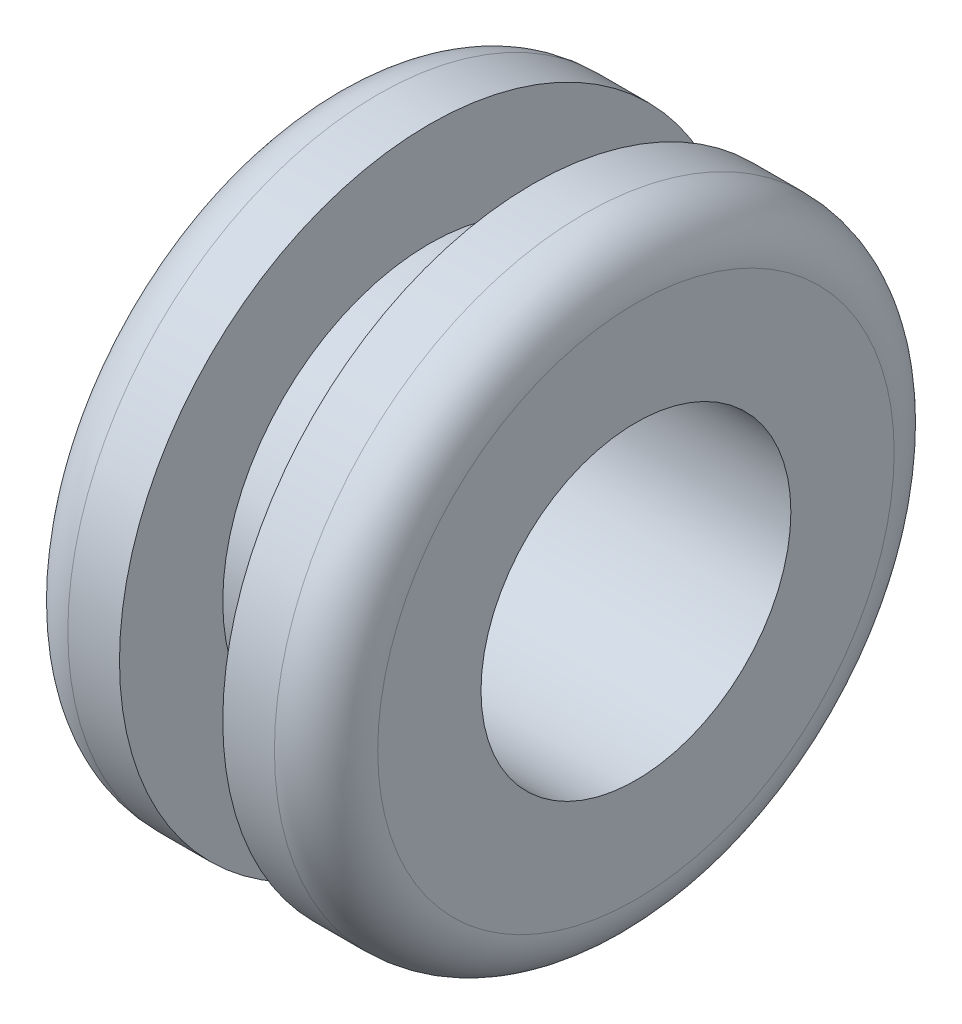
ISO-10303-21;
HEADER;
FILE_DESCRIPTION(('STEP AP214'),'2;1');
FILE_NAME('part.step','',(''),(''),'','','');
FILE_SCHEMA(('AUTOMOTIVE_DESIGN { 1 0 10303 214 1 1 1 1 }'));
ENDSEC;
DATA;
#1=APPLICATION_CONTEXT('core data for automotive mechanical design processes');
#2=APPLICATION_PROTOCOL_DEFINITION('international standard','automotive_design',2000,#1);
#3=PRODUCT_CONTEXT('',#1,'mechanical');
#4=PRODUCT('Part','Part','',(#3));
#5=PRODUCT_RELATED_PRODUCT_CATEGORY('part','',(#4));
#6=PRODUCT_DEFINITION_FORMATION('','',#4);
#7=PRODUCT_DEFINITION_CONTEXT('part definition',#1,'design');
#8=PRODUCT_DEFINITION('design','',#6,#7);
#9=PRODUCT_DEFINITION_SHAPE('','',#8);
#10=(LENGTH_UNIT() NAMED_UNIT(*) SI_UNIT(.MILLI.,.METRE.));
#11=(NAMED_UNIT(*) PLANE_ANGLE_UNIT() SI_UNIT($,.RADIAN.));
#12=(NAMED_UNIT(*) SI_UNIT($,.STERADIAN.) SOLID_ANGLE_UNIT());
#13=UNCERTAINTY_MEASURE_WITH_UNIT(LENGTH_MEASURE(1.E-05),#10,'distance_accuracy_value','');
#14=(GEOMETRIC_REPRESENTATION_CONTEXT(3) GLOBAL_UNCERTAINTY_ASSIGNED_CONTEXT((#13)) GLOBAL_UNIT_ASSIGNED_CONTEXT((#10,
#11,#12)) REPRESENTATION_CONTEXT('',''));
#15=CARTESIAN_POINT('',(0.,0.,0.));
#16=DIRECTION('',(0.,0.,1.));
#17=DIRECTION('',(1.,0.,0.));
#18=AXIS2_PLACEMENT_3D('',#15,#16,#17);
#19=CARTESIAN_POINT('',(3.,3.,0.));
#20=DIRECTION('',(-1.,0.,0.));
#21=DIRECTION('',(0.,0.,1.));
#22=AXIS2_PLACEMENT_3D('',#19,#20,#21);
#23=PLANE('',#22);
#24=CARTESIAN_POINT('',(3.,0.,0.));
#25=DIRECTION('',(-1.,0.,0.));
#26=DIRECTION('',(0.,0.,1.));
#27=AXIS2_PLACEMENT_3D('',#24,#25,#26);
#28=CIRCLE('',#27,3.);
#29=CARTESIAN_POINT('',(3.,0.,3.));
#30=VERTEX_POINT('',#29);
#31=EDGE_CURVE('E56',#30,#30,#28,.T.);
#32=ORIENTED_EDGE('',*,*,#31,.T.);
#33=EDGE_LOOP('',(#32));
#34=FACE_BOUND('',#33,.T.);
#35=CARTESIAN_POINT('',(3.,0.,0.));
#36=DIRECTION('',(-1.,0.,0.));
#37=DIRECTION('',(0.,0.,-1.));
#38=AXIS2_PLACEMENT_3D('',#35,#36,#37);
#39=CIRCLE('',#38,4.99999999999999);
#40=CARTESIAN_POINT('',(3.,0.,-4.99999999999999));
#41=VERTEX_POINT('',#40);
#42=CARTESIAN_POINT('',(3.,0.,4.99999999999999));
#43=VERTEX_POINT('',#42);
#44=EDGE_CURVE('E45',#41,#43,#39,.T.);
#45=ORIENTED_EDGE('',*,*,#44,.F.);
#46=CARTESIAN_POINT('',(3.,0.,0.));
#47=DIRECTION('',(-1.,0.,0.));
#48=DIRECTION('',(0.,0.,1.));
#49=AXIS2_PLACEMENT_3D('',#46,#47,#48);
#50=CIRCLE('',#49,4.99999999999999);
#51=EDGE_CURVE('E47',#43,#41,#50,.T.);
#52=ORIENTED_EDGE('',*,*,#51,.F.);
#53=EDGE_LOOP('',(#45,#52));
#54=FACE_BOUND('',#53,.T.);
#55=ADVANCED_FACE('F16',(#34,#54),#23,.F.);
#56=CARTESIAN_POINT('',(-5.56307659043652,0.,0.));
#57=DIRECTION('',(-1.,0.,0.));
#58=DIRECTION('',(0.,0.,1.));
#59=AXIS2_PLACEMENT_3D('',#56,#57,#58);
#60=CYLINDRICAL_SURFACE('',#59,3.);
#61=ORIENTED_EDGE('',*,*,#31,.F.);
#62=EDGE_LOOP('',(#61));
#63=FACE_BOUND('',#62,.T.);
#64=CARTESIAN_POINT('',(-3.,0.,0.));
#65=DIRECTION('',(-1.,0.,0.));
#66=DIRECTION('',(0.,0.,1.));
#67=AXIS2_PLACEMENT_3D('',#64,#65,#66);
#68=CIRCLE('',#67,3.);
#69=CARTESIAN_POINT('',(-3.,0.,3.));
#70=VERTEX_POINT('',#69);
#71=EDGE_CURVE('E52',#70,#70,#68,.T.);
#72=ORIENTED_EDGE('',*,*,#71,.T.);
#73=EDGE_LOOP('',(#72));
#74=FACE_BOUND('',#73,.T.);
#75=ADVANCED_FACE('F81',(#63,#74),#60,.F.);
#76=CARTESIAN_POINT('',(2.,0.,0.));
#77=DIRECTION('',(-1.,0.,0.));
#78=DIRECTION('',(0.,0.,1.));
#79=AXIS2_PLACEMENT_3D('',#76,#77,#78);
#80=TOROIDAL_SURFACE('',#79,5.,0.999999999999999);
#81=CARTESIAN_POINT('',(1.99999999999999,0.,0.));
#82=DIRECTION('',(-1.,0.,0.));
#83=DIRECTION('',(0.,0.,1.));
#84=AXIS2_PLACEMENT_3D('',#81,#82,#83);
#85=CIRCLE('',#84,6.);
#86=CARTESIAN_POINT('',(1.99999999999999,0.,6.));
#87=VERTEX_POINT('',#86);
#88=EDGE_CURVE('E75',#87,#87,#85,.T.);
#89=ORIENTED_EDGE('',*,*,#88,.F.);
#90=EDGE_LOOP('',(#89));
#91=FACE_BOUND('',#90,.T.);
#92=ORIENTED_EDGE('',*,*,#51,.T.);
#93=ORIENTED_EDGE('',*,*,#44,.T.);
#94=EDGE_LOOP('',(#92,#93));
#95=FACE_BOUND('',#94,.T.);
#96=ADVANCED_FACE('F49',(#91,#95),#80,.T.);
#97=CARTESIAN_POINT('',(-3.,3.,0.));
#98=DIRECTION('',(1.,0.,0.));
#99=DIRECTION('',(0.,0.,-1.));
#100=AXIS2_PLACEMENT_3D('',#97,#98,#99);
#101=PLANE('',#100);
#102=CARTESIAN_POINT('',(-3.,0.,0.));
#103=DIRECTION('',(1.,0.,0.));
#104=DIRECTION('',(0.,0.,1.));
#105=AXIS2_PLACEMENT_3D('',#102,#103,#104);
#106=CIRCLE('',#105,5.);
#107=CARTESIAN_POINT('',(-3.,0.,5.));
#108=VERTEX_POINT('',#107);
#109=CARTESIAN_POINT('',(-3.,0.,-5.));
#110=VERTEX_POINT('',#109);
#111=EDGE_CURVE('E108',#108,#110,#106,.T.);
#112=ORIENTED_EDGE('',*,*,#111,.F.);
#113=CARTESIAN_POINT('',(-3.,0.,0.));
#114=DIRECTION('',(1.,0.,0.));
#115=DIRECTION('',(0.,0.,-1.));
#116=AXIS2_PLACEMENT_3D('',#113,#114,#115);
#117=CIRCLE('',#116,5.);
#118=EDGE_CURVE('E36',#110,#108,#117,.T.);
#119=ORIENTED_EDGE('',*,*,#118,.F.);
#120=EDGE_LOOP('',(#112,#119));
#121=FACE_BOUND('',#120,.T.);
#122=ORIENTED_EDGE('',*,*,#71,.F.);
#123=EDGE_LOOP('',(#122));
#124=FACE_BOUND('',#123,.T.);
#125=ADVANCED_FACE('F80',(#121,#124),#101,.F.);
#126=CARTESIAN_POINT('',(-5.56307659043652,0.,0.));
#127=DIRECTION('',(-1.,0.,0.));
#128=DIRECTION('',(0.,0.,1.));
#129=AXIS2_PLACEMENT_3D('',#126,#127,#128);
#130=CYLINDRICAL_SURFACE('',#129,6.);
#131=CARTESIAN_POINT('',(1.,0.,0.));
#132=DIRECTION('',(-1.,0.,0.));
#133=DIRECTION('',(0.,0.,1.));
#134=AXIS2_PLACEMENT_3D('',#131,#132,#133);
#135=CIRCLE('',#134,6.);
#136=CARTESIAN_POINT('',(1.,0.,6.));
#137=VERTEX_POINT('',#136);
#138=EDGE_CURVE('E100',#137,#137,#135,.F.);
#139=ORIENTED_EDGE('',*,*,#138,.T.);
#140=EDGE_LOOP('',(#139));
#141=FACE_BOUND('',#140,.T.);
#142=ORIENTED_EDGE('',*,*,#88,.T.);
#143=EDGE_LOOP('',(#142));
#144=FACE_BOUND('',#143,.T.);
#145=ADVANCED_FACE('F123',(#141,#144),#130,.T.);
#146=CARTESIAN_POINT('',(-2.,0.,0.));
#147=DIRECTION('',(-1.,0.,0.));
#148=DIRECTION('',(0.,0.,1.));
#149=AXIS2_PLACEMENT_3D('',#146,#147,#148);
#150=TOROIDAL_SURFACE('',#149,5.,1.);
#151=ORIENTED_EDGE('',*,*,#111,.T.);
#152=ORIENTED_EDGE('',*,*,#118,.T.);
#153=EDGE_LOOP('',(#151,#152));
#154=FACE_BOUND('',#153,.T.);
#155=CARTESIAN_POINT('',(-2.,0.,0.));
#156=DIRECTION('',(-1.,0.,0.));
#157=DIRECTION('',(0.,0.,1.));
#158=AXIS2_PLACEMENT_3D('',#155,#156,#157);
#159=CIRCLE('',#158,6.);
#160=CARTESIAN_POINT('',(-2.,0.,6.));
#161=VERTEX_POINT('',#160);
#162=EDGE_CURVE('E99',#161,#161,#159,.F.);
#163=ORIENTED_EDGE('',*,*,#162,.F.);
#164=EDGE_LOOP('',(#163));
#165=FACE_BOUND('',#164,.T.);
#166=ADVANCED_FACE('F112',(#154,#165),#150,.T.);
#167=CARTESIAN_POINT('',(1.,6.,0.));
#168=DIRECTION('',(1.,0.,0.));
#169=DIRECTION('',(0.,0.,-1.));
#170=AXIS2_PLACEMENT_3D('',#167,#168,#169);
#171=PLANE('',#170);
#172=ORIENTED_EDGE('',*,*,#138,.F.);
#173=EDGE_LOOP('',(#172));
#174=FACE_BOUND('',#173,.T.);
#175=CARTESIAN_POINT('',(1.,0.,0.));
#176=DIRECTION('',(-1.,0.,0.));
#177=DIRECTION('',(0.,0.,1.));
#178=AXIS2_PLACEMENT_3D('',#175,#176,#177);
#179=CIRCLE('',#178,4.);
#180=CARTESIAN_POINT('',(1.,0.,4.));
#181=VERTEX_POINT('',#180);
#182=EDGE_CURVE('E96',#181,#181,#179,.T.);
#183=ORIENTED_EDGE('',*,*,#182,.F.);
#184=EDGE_LOOP('',(#183));
#185=FACE_BOUND('',#184,.T.);
#186=ADVANCED_FACE('F122',(#174,#185),#171,.F.);
#187=CARTESIAN_POINT('',(-5.56307659043652,0.,0.));
#188=DIRECTION('',(-1.,0.,0.));
#189=DIRECTION('',(0.,0.,1.));
#190=AXIS2_PLACEMENT_3D('',#187,#188,#189);
#191=CYLINDRICAL_SURFACE('',#190,6.);
#192=ORIENTED_EDGE('',*,*,#162,.T.);
#193=EDGE_LOOP('',(#192));
#194=FACE_BOUND('',#193,.T.);
#195=CARTESIAN_POINT('',(-1.,0.,0.));
#196=DIRECTION('',(-1.,0.,0.));
#197=DIRECTION('',(0.,0.,1.));
#198=AXIS2_PLACEMENT_3D('',#195,#196,#197);
#199=CIRCLE('',#198,6.);
#200=CARTESIAN_POINT('',(-1.,0.,6.));
#201=VERTEX_POINT('',#200);
#202=EDGE_CURVE('E28',#201,#201,#199,.T.);
#203=ORIENTED_EDGE('',*,*,#202,.T.);
#204=EDGE_LOOP('',(#203));
#205=FACE_BOUND('',#204,.T.);
#206=ADVANCED_FACE('F172',(#194,#205),#191,.T.);
#207=CARTESIAN_POINT('',(-5.56307659043652,0.,0.));
#208=DIRECTION('',(-1.,0.,0.));
#209=DIRECTION('',(0.,0.,1.));
#210=AXIS2_PLACEMENT_3D('',#207,#208,#209);
#211=CYLINDRICAL_SURFACE('',#210,4.);
#212=CARTESIAN_POINT('',(-1.,0.,0.));
#213=DIRECTION('',(-1.,0.,0.));
#214=DIRECTION('',(0.,0.,1.));
#215=AXIS2_PLACEMENT_3D('',#212,#213,#214);
#216=CIRCLE('',#215,4.);
#217=CARTESIAN_POINT('',(-1.,0.,4.));
#218=VERTEX_POINT('',#217);
#219=EDGE_CURVE('E11',#218,#218,#216,.F.);
#220=ORIENTED_EDGE('',*,*,#219,.T.);
#221=EDGE_LOOP('',(#220));
#222=FACE_BOUND('',#221,.T.);
#223=ORIENTED_EDGE('',*,*,#182,.T.);
#224=EDGE_LOOP('',(#223));
#225=FACE_BOUND('',#224,.T.);
#226=ADVANCED_FACE('F166',(#222,#225),#211,.T.);
#227=CARTESIAN_POINT('',(-1.,6.,0.));
#228=DIRECTION('',(-1.,0.,0.));
#229=DIRECTION('',(0.,0.,1.));
#230=AXIS2_PLACEMENT_3D('',#227,#228,#229);
#231=PLANE('',#230);
#232=ORIENTED_EDGE('',*,*,#219,.F.);
#233=EDGE_LOOP('',(#232));
#234=FACE_BOUND('',#233,.T.);
#235=ORIENTED_EDGE('',*,*,#202,.F.);
#236=EDGE_LOOP('',(#235));
#237=FACE_BOUND('',#236,.T.);
#238=ADVANCED_FACE('F164',(#234,#237),#231,.F.);
#239=CLOSED_SHELL('',(#55,#75,#96,#125,#145,#166,#186,#206,#226,#238));
#240=MANIFOLD_SOLID_BREP('B1',#239);
#241=ADVANCED_BREP_SHAPE_REPRESENTATION('',(#18,#240),#14);
#242=SHAPE_DEFINITION_REPRESENTATION(#9,#241);
ENDSEC;
END-ISO-10303-21;
